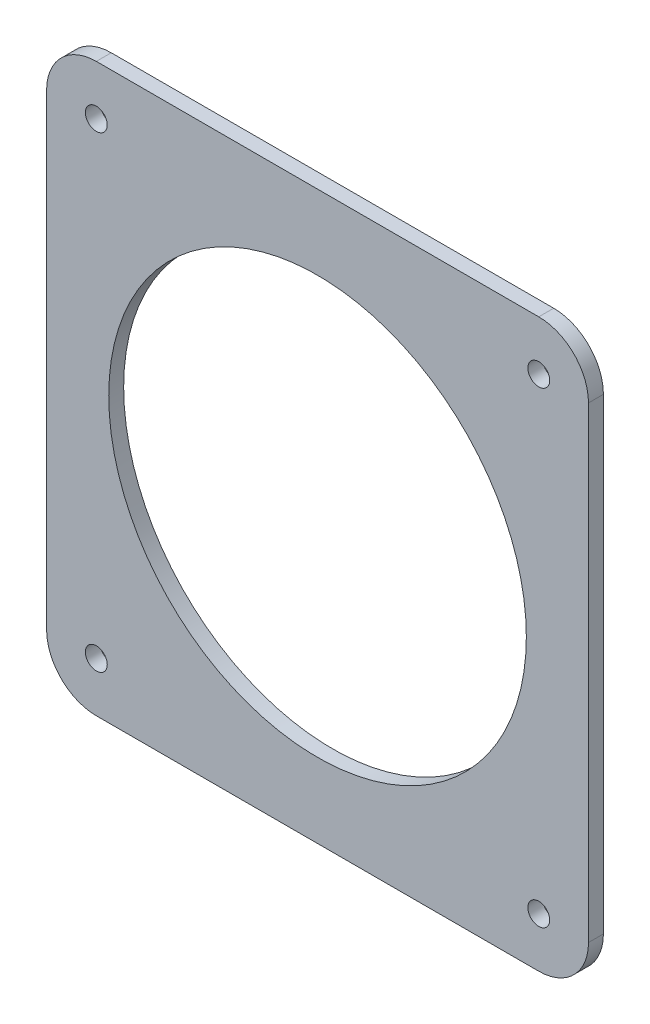
ISO-10303-21;
HEADER;
FILE_DESCRIPTION(('STEP AP214'),'2;1');
FILE_NAME('part.step','',(''),(''),'','','');
FILE_SCHEMA(('AUTOMOTIVE_DESIGN { 1 0 10303 214 1 1 1 1 }'));
ENDSEC;
DATA;
#1=APPLICATION_CONTEXT('core data for automotive mechanical design processes');
#2=APPLICATION_PROTOCOL_DEFINITION('international standard','automotive_design',2000,#1);
#3=PRODUCT_CONTEXT('',#1,'mechanical');
#4=PRODUCT('Part','Part','',(#3));
#5=PRODUCT_RELATED_PRODUCT_CATEGORY('part','',(#4));
#6=PRODUCT_DEFINITION_FORMATION('','',#4);
#7=PRODUCT_DEFINITION_CONTEXT('part definition',#1,'design');
#8=PRODUCT_DEFINITION('design','',#6,#7);
#9=PRODUCT_DEFINITION_SHAPE('','',#8);
#10=(LENGTH_UNIT() NAMED_UNIT(*) SI_UNIT(.MILLI.,.METRE.));
#11=(NAMED_UNIT(*) PLANE_ANGLE_UNIT() SI_UNIT($,.RADIAN.));
#12=(NAMED_UNIT(*) SI_UNIT($,.STERADIAN.) SOLID_ANGLE_UNIT());
#13=UNCERTAINTY_MEASURE_WITH_UNIT(LENGTH_MEASURE(1.E-05),#10,'distance_accuracy_value','');
#14=(GEOMETRIC_REPRESENTATION_CONTEXT(3) GLOBAL_UNCERTAINTY_ASSIGNED_CONTEXT((#13)) GLOBAL_UNIT_ASSIGNED_CONTEXT((#10,
#11,#12)) REPRESENTATION_CONTEXT('',''));
#15=CARTESIAN_POINT('',(0.,0.,0.));
#16=DIRECTION('',(0.,0.,1.));
#17=DIRECTION('',(1.,0.,0.));
#18=AXIS2_PLACEMENT_3D('',#15,#16,#17);
#19=CARTESIAN_POINT('',(0.,0.,3.));
#20=DIRECTION('',(0.,0.,1.));
#21=DIRECTION('',(1.,0.,0.));
#22=AXIS2_PLACEMENT_3D('',#19,#20,#21);
#23=PLANE('',#22);
#24=CARTESIAN_POINT('',(10.,-104.,3.));
#25=DIRECTION('',(0.,0.,1.));
#26=DIRECTION('',(1.,0.,0.));
#27=AXIS2_PLACEMENT_3D('',#24,#25,#26);
#28=CIRCLE('',#27,2.19999999999999);
#29=CARTESIAN_POINT('',(12.2,-104.,3.));
#30=VERTEX_POINT('',#29);
#31=EDGE_CURVE('E205',#30,#30,#28,.T.);
#32=ORIENTED_EDGE('',*,*,#31,.F.);
#33=EDGE_LOOP('',(#32));
#34=FACE_BOUND('',#33,.T.);
#35=CARTESIAN_POINT('',(99.,-104.,3.));
#36=DIRECTION('',(0.,0.,1.));
#37=DIRECTION('',(1.,0.,0.));
#38=AXIS2_PLACEMENT_3D('',#35,#36,#37);
#39=CIRCLE('',#38,2.2);
#40=CARTESIAN_POINT('',(101.2,-104.,3.));
#41=VERTEX_POINT('',#40);
#42=EDGE_CURVE('E191',#41,#41,#39,.T.);
#43=ORIENTED_EDGE('',*,*,#42,.F.);
#44=EDGE_LOOP('',(#43));
#45=FACE_BOUND('',#44,.T.);
#46=DIRECTION('',(-1.,0.,0.));
#47=VECTOR('',#46,1.);
#48=CARTESIAN_POINT('',(0.,0.,3.));
#49=LINE('',#48,#47);
#50=CARTESIAN_POINT('',(99.,0.,3.));
#51=VERTEX_POINT('',#50);
#52=CARTESIAN_POINT('',(10.,0.,3.));
#53=VERTEX_POINT('',#52);
#54=EDGE_CURVE('E146',#51,#53,#49,.T.);
#55=ORIENTED_EDGE('',*,*,#54,.T.);
#56=CARTESIAN_POINT('',(10.,-10.,3.));
#57=DIRECTION('',(0.,0.,1.));
#58=DIRECTION('',(1.,0.,0.));
#59=AXIS2_PLACEMENT_3D('',#56,#57,#58);
#60=CIRCLE('',#59,10.);
#61=CARTESIAN_POINT('',(0.,-10.,3.));
#62=VERTEX_POINT('',#61);
#63=EDGE_CURVE('E163',#53,#62,#60,.T.);
#64=ORIENTED_EDGE('',*,*,#63,.T.);
#65=DIRECTION('',(0.,-1.,0.));
#66=VECTOR('',#65,1.);
#67=CARTESIAN_POINT('',(0.,0.,3.));
#68=LINE('',#67,#66);
#69=CARTESIAN_POINT('',(0.,-104.,3.));
#70=VERTEX_POINT('',#69);
#71=EDGE_CURVE('E128',#62,#70,#68,.T.);
#72=ORIENTED_EDGE('',*,*,#71,.T.);
#73=CARTESIAN_POINT('',(10.,-104.,3.));
#74=DIRECTION('',(0.,0.,1.));
#75=DIRECTION('',(1.,0.,0.));
#76=AXIS2_PLACEMENT_3D('',#73,#74,#75);
#77=CIRCLE('',#76,10.);
#78=CARTESIAN_POINT('',(10.,-114.,3.));
#79=VERTEX_POINT('',#78);
#80=EDGE_CURVE('E164',#70,#79,#77,.T.);
#81=ORIENTED_EDGE('',*,*,#80,.T.);
#82=DIRECTION('',(1.,0.,0.));
#83=VECTOR('',#82,1.);
#84=CARTESIAN_POINT('',(0.,-114.,3.));
#85=LINE('',#84,#83);
#86=CARTESIAN_POINT('',(99.,-114.,3.));
#87=VERTEX_POINT('',#86);
#88=EDGE_CURVE('E178',#79,#87,#85,.T.);
#89=ORIENTED_EDGE('',*,*,#88,.T.);
#90=CARTESIAN_POINT('',(99.,-104.,3.));
#91=DIRECTION('',(0.,0.,1.));
#92=DIRECTION('',(1.,0.,0.));
#93=AXIS2_PLACEMENT_3D('',#90,#91,#92);
#94=CIRCLE('',#93,10.);
#95=CARTESIAN_POINT('',(109.,-104.,3.));
#96=VERTEX_POINT('',#95);
#97=EDGE_CURVE('E61',#87,#96,#94,.T.);
#98=ORIENTED_EDGE('',*,*,#97,.T.);
#99=DIRECTION('',(0.,1.,0.));
#100=VECTOR('',#99,1.);
#101=CARTESIAN_POINT('',(109.,0.,3.));
#102=LINE('',#101,#100);
#103=CARTESIAN_POINT('',(109.,-9.99999999999999,3.));
#104=VERTEX_POINT('',#103);
#105=EDGE_CURVE('E185',#96,#104,#102,.T.);
#106=ORIENTED_EDGE('',*,*,#105,.T.);
#107=CARTESIAN_POINT('',(99.,-10.,3.));
#108=DIRECTION('',(0.,0.,1.));
#109=DIRECTION('',(1.,0.,0.));
#110=AXIS2_PLACEMENT_3D('',#107,#108,#109);
#111=CIRCLE('',#110,10.);
#112=EDGE_CURVE('E158',#104,#51,#111,.T.);
#113=ORIENTED_EDGE('',*,*,#112,.T.);
#114=EDGE_LOOP('',(#55,#64,#72,#81,#89,#98,#106,#113));
#115=FACE_BOUND('',#114,.T.);
#116=CARTESIAN_POINT('',(99.,-10.,3.));
#117=DIRECTION('',(0.,0.,1.));
#118=DIRECTION('',(1.,0.,0.));
#119=AXIS2_PLACEMENT_3D('',#116,#117,#118);
#120=CIRCLE('',#119,2.2);
#121=CARTESIAN_POINT('',(101.2,-10.,3.));
#122=VERTEX_POINT('',#121);
#123=EDGE_CURVE('E140',#122,#122,#120,.T.);
#124=ORIENTED_EDGE('',*,*,#123,.F.);
#125=EDGE_LOOP('',(#124));
#126=FACE_BOUND('',#125,.T.);
#127=CARTESIAN_POINT('',(10.,-10.,3.));
#128=DIRECTION('',(0.,0.,1.));
#129=DIRECTION('',(1.,0.,0.));
#130=AXIS2_PLACEMENT_3D('',#127,#128,#129);
#131=CIRCLE('',#130,2.2);
#132=CARTESIAN_POINT('',(12.2,-10.,3.));
#133=VERTEX_POINT('',#132);
#134=EDGE_CURVE('E196',#133,#133,#131,.T.);
#135=ORIENTED_EDGE('',*,*,#134,.F.);
#136=EDGE_LOOP('',(#135));
#137=FACE_BOUND('',#136,.T.);
#138=CARTESIAN_POINT('',(54.5,-57.,3.));
#139=DIRECTION('',(0.,0.,1.));
#140=DIRECTION('',(1.,0.,0.));
#141=AXIS2_PLACEMENT_3D('',#138,#139,#140);
#142=CIRCLE('',#141,42.);
#143=CARTESIAN_POINT('',(96.5,-57.,3.));
#144=VERTEX_POINT('',#143);
#145=EDGE_CURVE('E209',#144,#144,#142,.T.);
#146=ORIENTED_EDGE('',*,*,#145,.F.);
#147=EDGE_LOOP('',(#146));
#148=FACE_BOUND('',#147,.T.);
#149=ADVANCED_FACE('F43',(#34,#45,#115,#126,#137,#148),#23,.T.);
#150=CARTESIAN_POINT('',(0.,0.,0.));
#151=DIRECTION('',(0.,0.,1.));
#152=DIRECTION('',(1.,0.,0.));
#153=AXIS2_PLACEMENT_3D('',#150,#151,#152);
#154=PLANE('',#153);
#155=DIRECTION('',(0.,-1.,0.));
#156=VECTOR('',#155,1.);
#157=CARTESIAN_POINT('',(0.,0.,0.));
#158=LINE('',#157,#156);
#159=CARTESIAN_POINT('',(0.,-10.,0.));
#160=VERTEX_POINT('',#159);
#161=CARTESIAN_POINT('',(0.,-104.,0.));
#162=VERTEX_POINT('',#161);
#163=EDGE_CURVE('E126',#160,#162,#158,.T.);
#164=ORIENTED_EDGE('',*,*,#163,.F.);
#165=CARTESIAN_POINT('',(10.,-10.,0.));
#166=DIRECTION('',(0.,0.,1.));
#167=DIRECTION('',(1.,0.,0.));
#168=AXIS2_PLACEMENT_3D('',#165,#166,#167);
#169=CIRCLE('',#168,10.);
#170=CARTESIAN_POINT('',(10.,0.,0.));
#171=VERTEX_POINT('',#170);
#172=EDGE_CURVE('E110',#160,#171,#169,.F.);
#173=ORIENTED_EDGE('',*,*,#172,.T.);
#174=DIRECTION('',(-1.,0.,0.));
#175=VECTOR('',#174,1.);
#176=CARTESIAN_POINT('',(0.,0.,0.));
#177=LINE('',#176,#175);
#178=CARTESIAN_POINT('',(99.,0.,0.));
#179=VERTEX_POINT('',#178);
#180=EDGE_CURVE('E150',#179,#171,#177,.T.);
#181=ORIENTED_EDGE('',*,*,#180,.F.);
#182=CARTESIAN_POINT('',(99.,-10.,0.));
#183=DIRECTION('',(0.,0.,1.));
#184=DIRECTION('',(1.,0.,0.));
#185=AXIS2_PLACEMENT_3D('',#182,#183,#184);
#186=CIRCLE('',#185,10.);
#187=CARTESIAN_POINT('',(109.,-9.99999999999999,0.));
#188=VERTEX_POINT('',#187);
#189=EDGE_CURVE('E129',#179,#188,#186,.F.);
#190=ORIENTED_EDGE('',*,*,#189,.T.);
#191=DIRECTION('',(0.,1.,0.));
#192=VECTOR('',#191,1.);
#193=CARTESIAN_POINT('',(109.,0.,0.));
#194=LINE('',#193,#192);
#195=CARTESIAN_POINT('',(109.,-104.,0.));
#196=VERTEX_POINT('',#195);
#197=EDGE_CURVE('E138',#196,#188,#194,.T.);
#198=ORIENTED_EDGE('',*,*,#197,.F.);
#199=CARTESIAN_POINT('',(99.,-104.,0.));
#200=DIRECTION('',(0.,0.,1.));
#201=DIRECTION('',(1.,0.,0.));
#202=AXIS2_PLACEMENT_3D('',#199,#200,#201);
#203=CIRCLE('',#202,10.);
#204=CARTESIAN_POINT('',(99.,-114.,0.));
#205=VERTEX_POINT('',#204);
#206=EDGE_CURVE('E155',#196,#205,#203,.F.);
#207=ORIENTED_EDGE('',*,*,#206,.T.);
#208=DIRECTION('',(1.,0.,0.));
#209=VECTOR('',#208,1.);
#210=CARTESIAN_POINT('',(0.,-114.,0.));
#211=LINE('',#210,#209);
#212=CARTESIAN_POINT('',(10.,-114.,0.));
#213=VERTEX_POINT('',#212);
#214=EDGE_CURVE('E137',#213,#205,#211,.T.);
#215=ORIENTED_EDGE('',*,*,#214,.F.);
#216=CARTESIAN_POINT('',(10.,-104.,0.));
#217=DIRECTION('',(0.,0.,1.));
#218=DIRECTION('',(1.,0.,0.));
#219=AXIS2_PLACEMENT_3D('',#216,#217,#218);
#220=CIRCLE('',#219,10.);
#221=EDGE_CURVE('E119',#213,#162,#220,.F.);
#222=ORIENTED_EDGE('',*,*,#221,.T.);
#223=EDGE_LOOP('',(#164,#173,#181,#190,#198,#207,#215,#222));
#224=FACE_BOUND('',#223,.T.);
#225=CARTESIAN_POINT('',(99.,-10.,0.));
#226=DIRECTION('',(0.,0.,1.));
#227=DIRECTION('',(1.,0.,0.));
#228=AXIS2_PLACEMENT_3D('',#225,#226,#227);
#229=CIRCLE('',#228,2.2);
#230=CARTESIAN_POINT('',(101.2,-10.,0.));
#231=VERTEX_POINT('',#230);
#232=EDGE_CURVE('E141',#231,#231,#229,.T.);
#233=ORIENTED_EDGE('',*,*,#232,.T.);
#234=EDGE_LOOP('',(#233));
#235=FACE_BOUND('',#234,.T.);
#236=CARTESIAN_POINT('',(99.,-104.,0.));
#237=DIRECTION('',(0.,0.,1.));
#238=DIRECTION('',(1.,0.,0.));
#239=AXIS2_PLACEMENT_3D('',#236,#237,#238);
#240=CIRCLE('',#239,2.2);
#241=CARTESIAN_POINT('',(101.2,-104.,0.));
#242=VERTEX_POINT('',#241);
#243=EDGE_CURVE('E193',#242,#242,#240,.T.);
#244=ORIENTED_EDGE('',*,*,#243,.T.);
#245=EDGE_LOOP('',(#244));
#246=FACE_BOUND('',#245,.T.);
#247=CARTESIAN_POINT('',(10.,-10.,0.));
#248=DIRECTION('',(0.,0.,1.));
#249=DIRECTION('',(1.,0.,0.));
#250=AXIS2_PLACEMENT_3D('',#247,#248,#249);
#251=CIRCLE('',#250,2.2);
#252=CARTESIAN_POINT('',(12.2,-10.,0.));
#253=VERTEX_POINT('',#252);
#254=EDGE_CURVE('E197',#253,#253,#251,.T.);
#255=ORIENTED_EDGE('',*,*,#254,.T.);
#256=EDGE_LOOP('',(#255));
#257=FACE_BOUND('',#256,.T.);
#258=CARTESIAN_POINT('',(10.,-104.,0.));
#259=DIRECTION('',(0.,0.,1.));
#260=DIRECTION('',(1.,0.,0.));
#261=AXIS2_PLACEMENT_3D('',#258,#259,#260);
#262=CIRCLE('',#261,2.19999999999999);
#263=CARTESIAN_POINT('',(12.2,-104.,0.));
#264=VERTEX_POINT('',#263);
#265=EDGE_CURVE('E204',#264,#264,#262,.T.);
#266=ORIENTED_EDGE('',*,*,#265,.T.);
#267=EDGE_LOOP('',(#266));
#268=FACE_BOUND('',#267,.T.);
#269=CARTESIAN_POINT('',(54.5,-57.,0.));
#270=DIRECTION('',(0.,0.,1.));
#271=DIRECTION('',(1.,0.,0.));
#272=AXIS2_PLACEMENT_3D('',#269,#270,#271);
#273=CIRCLE('',#272,42.);
#274=CARTESIAN_POINT('',(96.5,-57.,0.));
#275=VERTEX_POINT('',#274);
#276=EDGE_CURVE('E212',#275,#275,#273,.T.);
#277=ORIENTED_EDGE('',*,*,#276,.T.);
#278=EDGE_LOOP('',(#277));
#279=FACE_BOUND('',#278,.T.);
#280=ADVANCED_FACE('F134',(#224,#235,#246,#257,#268,#279),#154,.F.);
#281=CARTESIAN_POINT('',(0.,0.,3.));
#282=DIRECTION('',(1.,0.,0.));
#283=DIRECTION('',(0.,1.,0.));
#284=AXIS2_PLACEMENT_3D('',#281,#282,#283);
#285=PLANE('',#284);
#286=ORIENTED_EDGE('',*,*,#71,.F.);
#287=DIRECTION('',(0.,0.,-1.));
#288=VECTOR('',#287,1.);
#289=CARTESIAN_POINT('',(0.,-10.,3.));
#290=LINE('',#289,#288);
#291=EDGE_CURVE('E111',#62,#160,#290,.T.);
#292=ORIENTED_EDGE('',*,*,#291,.T.);
#293=ORIENTED_EDGE('',*,*,#163,.T.);
#294=DIRECTION('',(0.,0.,-1.));
#295=VECTOR('',#294,1.);
#296=CARTESIAN_POINT('',(0.,-104.,3.));
#297=LINE('',#296,#295);
#298=EDGE_CURVE('E132',#162,#70,#297,.F.);
#299=ORIENTED_EDGE('',*,*,#298,.T.);
#300=EDGE_LOOP('',(#286,#292,#293,#299));
#301=FACE_BOUND('',#300,.T.);
#302=ADVANCED_FACE('F124',(#301),#285,.F.);
#303=CARTESIAN_POINT('',(0.,-114.,3.));
#304=DIRECTION('',(0.,1.,0.));
#305=DIRECTION('',(0.,0.,1.));
#306=AXIS2_PLACEMENT_3D('',#303,#304,#305);
#307=PLANE('',#306);
#308=ORIENTED_EDGE('',*,*,#88,.F.);
#309=DIRECTION('',(0.,0.,-1.));
#310=VECTOR('',#309,1.);
#311=CARTESIAN_POINT('',(10.,-114.,3.));
#312=LINE('',#311,#310);
#313=EDGE_CURVE('E169',#79,#213,#312,.T.);
#314=ORIENTED_EDGE('',*,*,#313,.T.);
#315=ORIENTED_EDGE('',*,*,#214,.T.);
#316=DIRECTION('',(0.,0.,-1.));
#317=VECTOR('',#316,1.);
#318=CARTESIAN_POINT('',(99.,-114.,3.));
#319=LINE('',#318,#317);
#320=EDGE_CURVE('E170',#205,#87,#319,.F.);
#321=ORIENTED_EDGE('',*,*,#320,.T.);
#322=EDGE_LOOP('',(#308,#314,#315,#321));
#323=FACE_BOUND('',#322,.T.);
#324=ADVANCED_FACE('F173',(#323),#307,.F.);
#325=CARTESIAN_POINT('',(109.,0.,3.));
#326=DIRECTION('',(-1.,0.,0.));
#327=DIRECTION('',(0.,-1.,0.));
#328=AXIS2_PLACEMENT_3D('',#325,#326,#327);
#329=PLANE('',#328);
#330=ORIENTED_EDGE('',*,*,#105,.F.);
#331=DIRECTION('',(0.,0.,-1.));
#332=VECTOR('',#331,1.);
#333=CARTESIAN_POINT('',(109.,-104.,3.));
#334=LINE('',#333,#332);
#335=EDGE_CURVE('E11',#96,#196,#334,.T.);
#336=ORIENTED_EDGE('',*,*,#335,.T.);
#337=ORIENTED_EDGE('',*,*,#197,.T.);
#338=DIRECTION('',(0.,0.,-1.));
#339=VECTOR('',#338,1.);
#340=CARTESIAN_POINT('',(109.,-10.,3.));
#341=LINE('',#340,#339);
#342=EDGE_CURVE('E51',#188,#104,#341,.F.);
#343=ORIENTED_EDGE('',*,*,#342,.T.);
#344=EDGE_LOOP('',(#330,#336,#337,#343));
#345=FACE_BOUND('',#344,.T.);
#346=ADVANCED_FACE('F181',(#345),#329,.F.);
#347=CARTESIAN_POINT('',(0.,0.,3.));
#348=DIRECTION('',(0.,-1.,0.));
#349=DIRECTION('',(0.,0.,-1.));
#350=AXIS2_PLACEMENT_3D('',#347,#348,#349);
#351=PLANE('',#350);
#352=ORIENTED_EDGE('',*,*,#180,.T.);
#353=DIRECTION('',(0.,0.,-1.));
#354=VECTOR('',#353,1.);
#355=CARTESIAN_POINT('',(10.,0.,3.));
#356=LINE('',#355,#354);
#357=EDGE_CURVE('E114',#171,#53,#356,.F.);
#358=ORIENTED_EDGE('',*,*,#357,.T.);
#359=ORIENTED_EDGE('',*,*,#54,.F.);
#360=DIRECTION('',(0.,0.,-1.));
#361=VECTOR('',#360,1.);
#362=CARTESIAN_POINT('',(99.,0.,3.));
#363=LINE('',#362,#361);
#364=EDGE_CURVE('E117',#51,#179,#363,.T.);
#365=ORIENTED_EDGE('',*,*,#364,.T.);
#366=EDGE_LOOP('',(#352,#358,#359,#365));
#367=FACE_BOUND('',#366,.T.);
#368=ADVANCED_FACE('F234',(#367),#351,.F.);
#369=CARTESIAN_POINT('',(99.,-10.,3.));
#370=DIRECTION('',(0.,0.,-1.));
#371=DIRECTION('',(-1.,0.,0.));
#372=AXIS2_PLACEMENT_3D('',#369,#370,#371);
#373=CYLINDRICAL_SURFACE('',#372,2.2);
#374=ORIENTED_EDGE('',*,*,#123,.T.);
#375=EDGE_LOOP('',(#374));
#376=FACE_BOUND('',#375,.T.);
#377=ORIENTED_EDGE('',*,*,#232,.F.);
#378=EDGE_LOOP('',(#377));
#379=FACE_BOUND('',#378,.T.);
#380=ADVANCED_FACE('F232',(#376,#379),#373,.F.);
#381=CARTESIAN_POINT('',(99.,-104.,3.));
#382=DIRECTION('',(0.,0.,-1.));
#383=DIRECTION('',(-1.,0.,0.));
#384=AXIS2_PLACEMENT_3D('',#381,#382,#383);
#385=CYLINDRICAL_SURFACE('',#384,2.2);
#386=ORIENTED_EDGE('',*,*,#42,.T.);
#387=EDGE_LOOP('',(#386));
#388=FACE_BOUND('',#387,.T.);
#389=ORIENTED_EDGE('',*,*,#243,.F.);
#390=EDGE_LOOP('',(#389));
#391=FACE_BOUND('',#390,.T.);
#392=ADVANCED_FACE('F266',(#388,#391),#385,.F.);
#393=CARTESIAN_POINT('',(10.,-10.,3.));
#394=DIRECTION('',(0.,0.,-1.));
#395=DIRECTION('',(-1.,0.,0.));
#396=AXIS2_PLACEMENT_3D('',#393,#394,#395);
#397=CYLINDRICAL_SURFACE('',#396,2.2);
#398=ORIENTED_EDGE('',*,*,#134,.T.);
#399=EDGE_LOOP('',(#398));
#400=FACE_BOUND('',#399,.T.);
#401=ORIENTED_EDGE('',*,*,#254,.F.);
#402=EDGE_LOOP('',(#401));
#403=FACE_BOUND('',#402,.T.);
#404=ADVANCED_FACE('F265',(#400,#403),#397,.F.);
#405=CARTESIAN_POINT('',(10.,-104.,3.));
#406=DIRECTION('',(0.,0.,-1.));
#407=DIRECTION('',(-1.,0.,0.));
#408=AXIS2_PLACEMENT_3D('',#405,#406,#407);
#409=CYLINDRICAL_SURFACE('',#408,2.19999999999999);
#410=ORIENTED_EDGE('',*,*,#31,.T.);
#411=EDGE_LOOP('',(#410));
#412=FACE_BOUND('',#411,.T.);
#413=ORIENTED_EDGE('',*,*,#265,.F.);
#414=EDGE_LOOP('',(#413));
#415=FACE_BOUND('',#414,.T.);
#416=ADVANCED_FACE('F262',(#412,#415),#409,.F.);
#417=CARTESIAN_POINT('',(54.5,-57.,3.));
#418=DIRECTION('',(0.,0.,-1.));
#419=DIRECTION('',(-1.,0.,0.));
#420=AXIS2_PLACEMENT_3D('',#417,#418,#419);
#421=CYLINDRICAL_SURFACE('',#420,42.);
#422=ORIENTED_EDGE('',*,*,#145,.T.);
#423=EDGE_LOOP('',(#422));
#424=FACE_BOUND('',#423,.T.);
#425=ORIENTED_EDGE('',*,*,#276,.F.);
#426=EDGE_LOOP('',(#425));
#427=FACE_BOUND('',#426,.T.);
#428=ADVANCED_FACE('F220',(#424,#427),#421,.F.);
#429=CARTESIAN_POINT('',(10.,-10.,3.));
#430=DIRECTION('',(0.,0.,-1.));
#431=DIRECTION('',(-1.,0.,0.));
#432=AXIS2_PLACEMENT_3D('',#429,#430,#431);
#433=CYLINDRICAL_SURFACE('',#432,10.);
#434=ORIENTED_EDGE('',*,*,#63,.F.);
#435=ORIENTED_EDGE('',*,*,#357,.F.);
#436=ORIENTED_EDGE('',*,*,#172,.F.);
#437=ORIENTED_EDGE('',*,*,#291,.F.);
#438=EDGE_LOOP('',(#434,#435,#436,#437));
#439=FACE_BOUND('',#438,.T.);
#440=ADVANCED_FACE('F115',(#439),#433,.T.);
#441=CARTESIAN_POINT('',(10.,-104.,3.));
#442=DIRECTION('',(0.,0.,-1.));
#443=DIRECTION('',(-1.,0.,0.));
#444=AXIS2_PLACEMENT_3D('',#441,#442,#443);
#445=CYLINDRICAL_SURFACE('',#444,10.);
#446=ORIENTED_EDGE('',*,*,#80,.F.);
#447=ORIENTED_EDGE('',*,*,#298,.F.);
#448=ORIENTED_EDGE('',*,*,#221,.F.);
#449=ORIENTED_EDGE('',*,*,#313,.F.);
#450=EDGE_LOOP('',(#446,#447,#448,#449));
#451=FACE_BOUND('',#450,.T.);
#452=ADVANCED_FACE('F246',(#451),#445,.T.);
#453=CARTESIAN_POINT('',(99.,-104.,3.));
#454=DIRECTION('',(0.,0.,-1.));
#455=DIRECTION('',(-1.,0.,0.));
#456=AXIS2_PLACEMENT_3D('',#453,#454,#455);
#457=CYLINDRICAL_SURFACE('',#456,10.);
#458=ORIENTED_EDGE('',*,*,#97,.F.);
#459=ORIENTED_EDGE('',*,*,#320,.F.);
#460=ORIENTED_EDGE('',*,*,#206,.F.);
#461=ORIENTED_EDGE('',*,*,#335,.F.);
#462=EDGE_LOOP('',(#458,#459,#460,#461));
#463=FACE_BOUND('',#462,.T.);
#464=ADVANCED_FACE('F182',(#463),#457,.T.);
#465=CARTESIAN_POINT('',(99.,-10.,3.));
#466=DIRECTION('',(0.,0.,-1.));
#467=DIRECTION('',(-1.,0.,0.));
#468=AXIS2_PLACEMENT_3D('',#465,#466,#467);
#469=CYLINDRICAL_SURFACE('',#468,10.);
#470=ORIENTED_EDGE('',*,*,#112,.F.);
#471=ORIENTED_EDGE('',*,*,#342,.F.);
#472=ORIENTED_EDGE('',*,*,#189,.F.);
#473=ORIENTED_EDGE('',*,*,#364,.F.);
#474=EDGE_LOOP('',(#470,#471,#472,#473));
#475=FACE_BOUND('',#474,.T.);
#476=ADVANCED_FACE('F44',(#475),#469,.T.);
#477=CLOSED_SHELL('',(#149,#280,#302,#324,#346,#368,#380,#392,#404,#416,#428,#440,#452,#464,#476));
#478=MANIFOLD_SOLID_BREP('B2',#477);
#479=ADVANCED_BREP_SHAPE_REPRESENTATION('',(#18,#478),#14);
#480=SHAPE_DEFINITION_REPRESENTATION(#9,#479);
ENDSEC;
END-ISO-10303-21;
